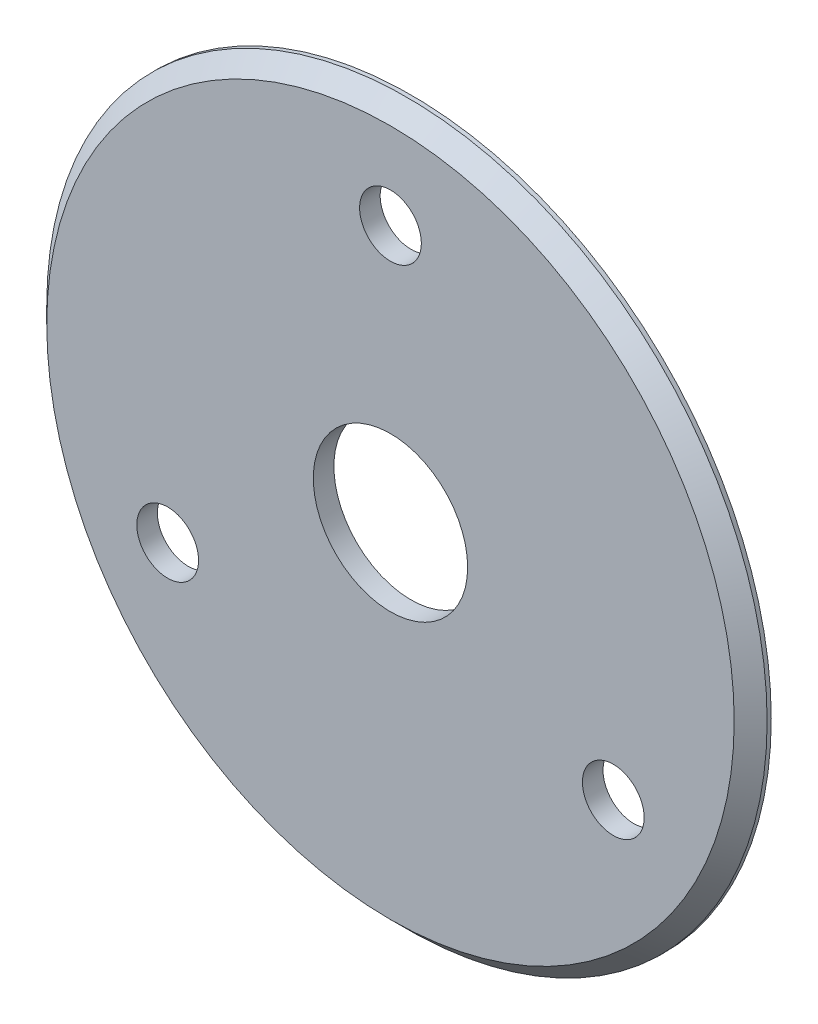
ISO-10303-21;
HEADER;
FILE_DESCRIPTION(('STEP AP214'),'2;1');
FILE_NAME('part.step','',(''),(''),'','','');
FILE_SCHEMA(('AUTOMOTIVE_DESIGN { 1 0 10303 214 1 1 1 1 }'));
ENDSEC;
DATA;
#1=APPLICATION_CONTEXT('core data for automotive mechanical design processes');
#2=APPLICATION_PROTOCOL_DEFINITION('international standard','automotive_design',2000,#1);
#3=PRODUCT_CONTEXT('',#1,'mechanical');
#4=PRODUCT('Part','Part','',(#3));
#5=PRODUCT_RELATED_PRODUCT_CATEGORY('part','',(#4));
#6=PRODUCT_DEFINITION_FORMATION('','',#4);
#7=PRODUCT_DEFINITION_CONTEXT('part definition',#1,'design');
#8=PRODUCT_DEFINITION('design','',#6,#7);
#9=PRODUCT_DEFINITION_SHAPE('','',#8);
#10=(LENGTH_UNIT() NAMED_UNIT(*) SI_UNIT(.MILLI.,.METRE.));
#11=(NAMED_UNIT(*) PLANE_ANGLE_UNIT() SI_UNIT($,.RADIAN.));
#12=(NAMED_UNIT(*) SI_UNIT($,.STERADIAN.) SOLID_ANGLE_UNIT());
#13=UNCERTAINTY_MEASURE_WITH_UNIT(LENGTH_MEASURE(1.E-05),#10,'distance_accuracy_value','');
#14=(GEOMETRIC_REPRESENTATION_CONTEXT(3) GLOBAL_UNCERTAINTY_ASSIGNED_CONTEXT((#13)) GLOBAL_UNIT_ASSIGNED_CONTEXT((#10,
#11,#12)) REPRESENTATION_CONTEXT('',''));
#15=CARTESIAN_POINT('',(0.,0.,0.));
#16=DIRECTION('',(0.,0.,1.));
#17=DIRECTION('',(1.,0.,0.));
#18=AXIS2_PLACEMENT_3D('',#15,#16,#17);
#19=CARTESIAN_POINT('',(0.,0.,2.));
#20=DIRECTION('',(0.,0.,1.));
#21=DIRECTION('',(1.,0.,0.));
#22=AXIS2_PLACEMENT_3D('',#19,#20,#21);
#23=PLANE('',#22);
#24=CARTESIAN_POINT('',(0.,0.,2.));
#25=DIRECTION('',(0.,0.,1.));
#26=DIRECTION('',(1.,0.,0.));
#27=AXIS2_PLACEMENT_3D('',#24,#25,#26);
#28=CIRCLE('',#27,33.4);
#29=CARTESIAN_POINT('',(33.4,0.,2.));
#30=VERTEX_POINT('',#29);
#31=EDGE_CURVE('E52',#30,#30,#28,.T.);
#32=ORIENTED_EDGE('',*,*,#31,.T.);
#33=EDGE_LOOP('',(#32));
#34=FACE_BOUND('',#33,.T.);
#35=CARTESIAN_POINT('',(21.6506350946126,-12.4999999999991,2.));
#36=DIRECTION('',(0.,0.,1.));
#37=DIRECTION('',(1.,0.,0.));
#38=AXIS2_PLACEMENT_3D('',#35,#36,#37);
#39=CIRCLE('',#38,3.00000000000137);
#40=CARTESIAN_POINT('',(24.6506350946139,-12.4999999999991,2.));
#41=VERTEX_POINT('',#40);
#42=EDGE_CURVE('E77',#41,#41,#39,.T.);
#43=ORIENTED_EDGE('',*,*,#42,.F.);
#44=EDGE_LOOP('',(#43));
#45=FACE_BOUND('',#44,.T.);
#46=CARTESIAN_POINT('',(0.,0.,2.));
#47=DIRECTION('',(0.,0.,1.));
#48=DIRECTION('',(1.,0.,0.));
#49=AXIS2_PLACEMENT_3D('',#46,#47,#48);
#50=CIRCLE('',#49,7.5);
#51=CARTESIAN_POINT('',(7.5,0.,2.));
#52=VERTEX_POINT('',#51);
#53=EDGE_CURVE('E62',#52,#52,#50,.T.);
#54=ORIENTED_EDGE('',*,*,#53,.F.);
#55=EDGE_LOOP('',(#54));
#56=FACE_BOUND('',#55,.T.);
#57=CARTESIAN_POINT('',(0.,25.,2.));
#58=DIRECTION('',(0.,0.,1.));
#59=DIRECTION('',(1.,0.,0.));
#60=AXIS2_PLACEMENT_3D('',#57,#58,#59);
#61=CIRCLE('',#60,3.);
#62=CARTESIAN_POINT('',(3.,25.,2.));
#63=VERTEX_POINT('',#62);
#64=EDGE_CURVE('E69',#63,#63,#61,.T.);
#65=ORIENTED_EDGE('',*,*,#64,.F.);
#66=EDGE_LOOP('',(#65));
#67=FACE_BOUND('',#66,.T.);
#68=CARTESIAN_POINT('',(-21.6506350946094,-12.5000000000009,2.));
#69=DIRECTION('',(0.,0.,1.));
#70=DIRECTION('',(1.,0.,0.));
#71=AXIS2_PLACEMENT_3D('',#68,#69,#70);
#72=CIRCLE('',#71,3.00000000000201);
#73=CARTESIAN_POINT('',(-18.6506350946074,-12.5000000000009,2.));
#74=VERTEX_POINT('',#73);
#75=EDGE_CURVE('E85',#74,#74,#72,.T.);
#76=ORIENTED_EDGE('',*,*,#75,.F.);
#77=EDGE_LOOP('',(#76));
#78=FACE_BOUND('',#77,.T.);
#79=ADVANCED_FACE('F43',(#34,#45,#56,#67,#78),#23,.T.);
#80=CARTESIAN_POINT('',(0.,0.,0.));
#81=DIRECTION('',(0.,0.,1.));
#82=DIRECTION('',(1.,0.,0.));
#83=AXIS2_PLACEMENT_3D('',#80,#81,#82);
#84=PLANE('',#83);
#85=CARTESIAN_POINT('',(0.,0.,0.));
#86=DIRECTION('',(0.,0.,1.));
#87=DIRECTION('',(1.,0.,0.));
#88=AXIS2_PLACEMENT_3D('',#85,#86,#87);
#89=CIRCLE('',#88,35.);
#90=CARTESIAN_POINT('',(35.,0.,0.));
#91=VERTEX_POINT('',#90);
#92=EDGE_CURVE('E57',#91,#91,#89,.T.);
#93=ORIENTED_EDGE('',*,*,#92,.F.);
#94=EDGE_LOOP('',(#93));
#95=FACE_BOUND('',#94,.T.);
#96=CARTESIAN_POINT('',(0.,0.,0.));
#97=DIRECTION('',(0.,0.,1.));
#98=DIRECTION('',(1.,0.,0.));
#99=AXIS2_PLACEMENT_3D('',#96,#97,#98);
#100=CIRCLE('',#99,7.5);
#101=CARTESIAN_POINT('',(7.5,0.,0.));
#102=VERTEX_POINT('',#101);
#103=EDGE_CURVE('E65',#102,#102,#100,.T.);
#104=ORIENTED_EDGE('',*,*,#103,.T.);
#105=EDGE_LOOP('',(#104));
#106=FACE_BOUND('',#105,.T.);
#107=CARTESIAN_POINT('',(0.,25.,0.));
#108=DIRECTION('',(0.,0.,1.));
#109=DIRECTION('',(1.,0.,0.));
#110=AXIS2_PLACEMENT_3D('',#107,#108,#109);
#111=CIRCLE('',#110,3.);
#112=CARTESIAN_POINT('',(3.,25.,0.));
#113=VERTEX_POINT('',#112);
#114=EDGE_CURVE('E73',#113,#113,#111,.T.);
#115=ORIENTED_EDGE('',*,*,#114,.T.);
#116=EDGE_LOOP('',(#115));
#117=FACE_BOUND('',#116,.T.);
#118=CARTESIAN_POINT('',(21.6506350946126,-12.4999999999991,0.));
#119=DIRECTION('',(0.,0.,1.));
#120=DIRECTION('',(1.,0.,0.));
#121=AXIS2_PLACEMENT_3D('',#118,#119,#120);
#122=CIRCLE('',#121,3.00000000000137);
#123=CARTESIAN_POINT('',(24.6506350946139,-12.4999999999991,0.));
#124=VERTEX_POINT('',#123);
#125=EDGE_CURVE('E81',#124,#124,#122,.T.);
#126=ORIENTED_EDGE('',*,*,#125,.T.);
#127=EDGE_LOOP('',(#126));
#128=FACE_BOUND('',#127,.T.);
#129=CARTESIAN_POINT('',(-21.6506350946094,-12.5000000000009,0.));
#130=DIRECTION('',(0.,0.,1.));
#131=DIRECTION('',(1.,0.,0.));
#132=AXIS2_PLACEMENT_3D('',#129,#130,#131);
#133=CIRCLE('',#132,3.00000000000201);
#134=CARTESIAN_POINT('',(-18.6506350946074,-12.5000000000009,0.));
#135=VERTEX_POINT('',#134);
#136=EDGE_CURVE('E89',#135,#135,#133,.T.);
#137=ORIENTED_EDGE('',*,*,#136,.T.);
#138=EDGE_LOOP('',(#137));
#139=FACE_BOUND('',#138,.T.);
#140=ADVANCED_FACE('F101',(#95,#106,#117,#128,#139),#84,.F.);
#141=CARTESIAN_POINT('',(0.,0.,2.));
#142=DIRECTION('',(0.,0.,-1.));
#143=DIRECTION('',(-1.,0.,0.));
#144=AXIS2_PLACEMENT_3D('',#141,#142,#143);
#145=CYLINDRICAL_SURFACE('',#144,35.);
#146=CARTESIAN_POINT('',(0.,0.,0.399999999999968));
#147=DIRECTION('',(0.,0.,1.));
#148=DIRECTION('',(1.,0.,0.));
#149=AXIS2_PLACEMENT_3D('',#146,#147,#148);
#150=CIRCLE('',#149,35.);
#151=CARTESIAN_POINT('',(35.,0.,0.399999999999968));
#152=VERTEX_POINT('',#151);
#153=EDGE_CURVE('E10',#152,#152,#150,.F.);
#154=ORIENTED_EDGE('',*,*,#153,.T.);
#155=EDGE_LOOP('',(#154));
#156=FACE_BOUND('',#155,.T.);
#157=ORIENTED_EDGE('',*,*,#92,.T.);
#158=EDGE_LOOP('',(#157));
#159=FACE_BOUND('',#158,.T.);
#160=ADVANCED_FACE('F106',(#156,#159),#145,.T.);
#161=CARTESIAN_POINT('',(0.,0.,2.));
#162=DIRECTION('',(0.,0.,-1.));
#163=DIRECTION('',(-1.,0.,0.));
#164=AXIS2_PLACEMENT_3D('',#161,#162,#163);
#165=CYLINDRICAL_SURFACE('',#164,7.5);
#166=ORIENTED_EDGE('',*,*,#53,.T.);
#167=EDGE_LOOP('',(#166));
#168=FACE_BOUND('',#167,.T.);
#169=ORIENTED_EDGE('',*,*,#103,.F.);
#170=EDGE_LOOP('',(#169));
#171=FACE_BOUND('',#170,.T.);
#172=ADVANCED_FACE('F111',(#168,#171),#165,.F.);
#173=CARTESIAN_POINT('',(0.,25.,2.));
#174=DIRECTION('',(0.,0.,-1.));
#175=DIRECTION('',(-1.,0.,0.));
#176=AXIS2_PLACEMENT_3D('',#173,#174,#175);
#177=CYLINDRICAL_SURFACE('',#176,3.);
#178=ORIENTED_EDGE('',*,*,#64,.T.);
#179=EDGE_LOOP('',(#178));
#180=FACE_BOUND('',#179,.T.);
#181=ORIENTED_EDGE('',*,*,#114,.F.);
#182=EDGE_LOOP('',(#181));
#183=FACE_BOUND('',#182,.T.);
#184=ADVANCED_FACE('F117',(#180,#183),#177,.F.);
#185=CARTESIAN_POINT('',(21.6506350946126,-12.4999999999991,2.));
#186=DIRECTION('',(0.,0.,-1.));
#187=DIRECTION('',(-1.,0.,0.));
#188=AXIS2_PLACEMENT_3D('',#185,#186,#187);
#189=CYLINDRICAL_SURFACE('',#188,3.00000000000137);
#190=ORIENTED_EDGE('',*,*,#42,.T.);
#191=EDGE_LOOP('',(#190));
#192=FACE_BOUND('',#191,.T.);
#193=ORIENTED_EDGE('',*,*,#125,.F.);
#194=EDGE_LOOP('',(#193));
#195=FACE_BOUND('',#194,.T.);
#196=ADVANCED_FACE('F130',(#192,#195),#189,.F.);
#197=CARTESIAN_POINT('',(-21.6506350946094,-12.5000000000009,2.));
#198=DIRECTION('',(0.,0.,-1.));
#199=DIRECTION('',(-1.,0.,0.));
#200=AXIS2_PLACEMENT_3D('',#197,#198,#199);
#201=CYLINDRICAL_SURFACE('',#200,3.00000000000201);
#202=ORIENTED_EDGE('',*,*,#75,.T.);
#203=EDGE_LOOP('',(#202));
#204=FACE_BOUND('',#203,.T.);
#205=ORIENTED_EDGE('',*,*,#136,.F.);
#206=EDGE_LOOP('',(#205));
#207=FACE_BOUND('',#206,.T.);
#208=ADVANCED_FACE('F97',(#204,#207),#201,.F.);
#209=CARTESIAN_POINT('',(0.,0.,2.));
#210=DIRECTION('',(0.,0.,-1.));
#211=DIRECTION('',(-1.,0.,0.));
#212=AXIS2_PLACEMENT_3D('',#209,#210,#211);
#213=CONICAL_SURFACE('',#212,33.4,0.785398163397442);
#214=ORIENTED_EDGE('',*,*,#153,.F.);
#215=EDGE_LOOP('',(#214));
#216=FACE_BOUND('',#215,.T.);
#217=ORIENTED_EDGE('',*,*,#31,.F.);
#218=EDGE_LOOP('',(#217));
#219=FACE_BOUND('',#218,.T.);
#220=ADVANCED_FACE('F46',(#216,#219),#213,.T.);
#221=CLOSED_SHELL('',(#79,#140,#160,#172,#184,#196,#208,#220));
#222=MANIFOLD_SOLID_BREP('B2',#221);
#223=ADVANCED_BREP_SHAPE_REPRESENTATION('',(#18,#222),#14);
#224=SHAPE_DEFINITION_REPRESENTATION(#9,#223);
ENDSEC;
END-ISO-10303-21;
